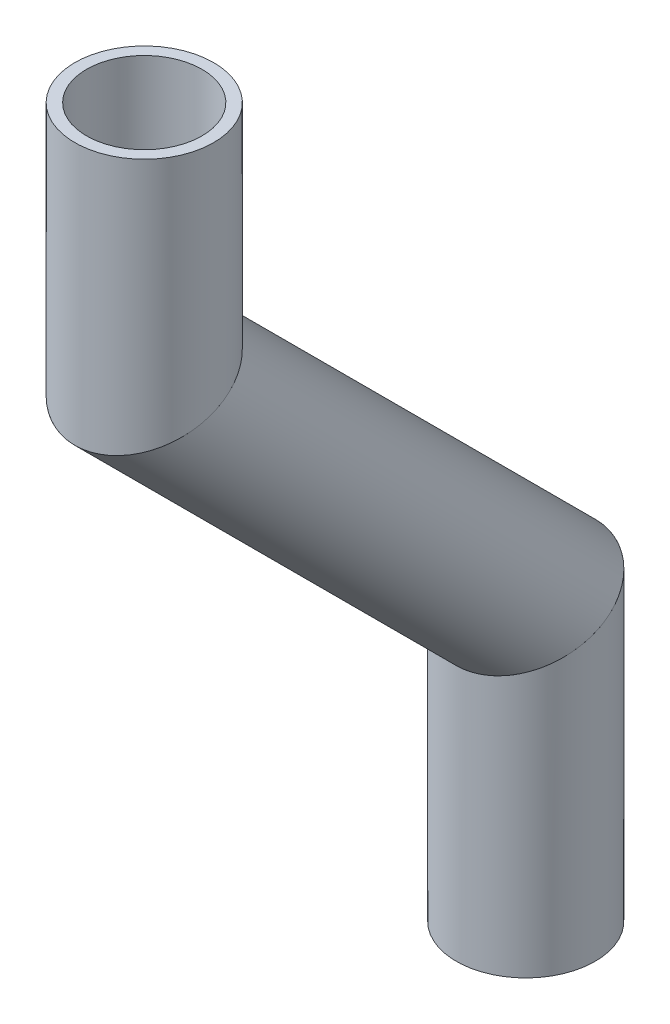
ISO-10303-21;
HEADER;
FILE_DESCRIPTION(('STEP AP214'),'2;1');
FILE_NAME('part.step','',(''),(''),'','','');
FILE_SCHEMA(('AUTOMOTIVE_DESIGN { 1 0 10303 214 1 1 1 1 }'));
ENDSEC;
DATA;
#1=APPLICATION_CONTEXT('core data for automotive mechanical design processes');
#2=APPLICATION_PROTOCOL_DEFINITION('international standard','automotive_design',2000,#1);
#3=PRODUCT_CONTEXT('',#1,'mechanical');
#4=PRODUCT('Part','Part','',(#3));
#5=PRODUCT_RELATED_PRODUCT_CATEGORY('part','',(#4));
#6=PRODUCT_DEFINITION_FORMATION('','',#4);
#7=PRODUCT_DEFINITION_CONTEXT('part definition',#1,'design');
#8=PRODUCT_DEFINITION('design','',#6,#7);
#9=PRODUCT_DEFINITION_SHAPE('','',#8);
#10=(LENGTH_UNIT() NAMED_UNIT(*) SI_UNIT(.MILLI.,.METRE.));
#11=(NAMED_UNIT(*) PLANE_ANGLE_UNIT() SI_UNIT($,.RADIAN.));
#12=(NAMED_UNIT(*) SI_UNIT($,.STERADIAN.) SOLID_ANGLE_UNIT());
#13=UNCERTAINTY_MEASURE_WITH_UNIT(LENGTH_MEASURE(1.E-05),#10,'distance_accuracy_value','');
#14=(GEOMETRIC_REPRESENTATION_CONTEXT(3) GLOBAL_UNCERTAINTY_ASSIGNED_CONTEXT((#13)) GLOBAL_UNIT_ASSIGNED_CONTEXT((#10,
#11,#12)) REPRESENTATION_CONTEXT('',''));
#15=CARTESIAN_POINT('',(0.,0.,0.));
#16=DIRECTION('',(0.,0.,1.));
#17=DIRECTION('',(1.,0.,0.));
#18=AXIS2_PLACEMENT_3D('',#15,#16,#17);
#19=CARTESIAN_POINT('',(0.,-456.70193255657,362.765281468092));
#20=DIRECTION('',(0.,1.,0.));
#21=DIRECTION('',(0.,0.,1.));
#22=AXIS2_PLACEMENT_3D('',#19,#20,#21);
#23=CYLINDRICAL_SURFACE('',#22,5.28319999999999);
#24=CARTESIAN_POINT('',(0.,-435.34106483783,362.765281468092));
#25=DIRECTION('',(0.,-1.,0.));
#26=DIRECTION('',(0.,0.,-1.));
#27=AXIS2_PLACEMENT_3D('',#24,#25,#26);
#28=CIRCLE('',#27,5.28319999999999);
#29=CARTESIAN_POINT('',(0.,-435.34106483783,357.482081468092));
#30=VERTEX_POINT('',#29);
#31=EDGE_CURVE('E55',#30,#30,#28,.T.);
#32=ORIENTED_EDGE('',*,*,#31,.F.);
#33=EDGE_LOOP('',(#32));
#34=FACE_BOUND('',#33,.T.);
#35=CARTESIAN_POINT('',(0.,-456.70193255657,362.765281468092));
#36=DIRECTION('',(0.,-0.923879532511287,-0.38268343236509));
#37=DIRECTION('',(0.,0.38268343236509,-0.923879532511287));
#38=AXIS2_PLACEMENT_3D('',#35,#36,#37);
#39=ELLIPSE('',#38,5.71849447258476,5.28319999999999);
#40=CARTESIAN_POINT('',(0.,-454.51355946384,357.482081468092));
#41=VERTEX_POINT('',#40);
#42=EDGE_CURVE('E51',#41,#41,#39,.T.);
#43=ORIENTED_EDGE('',*,*,#42,.T.);
#44=EDGE_LOOP('',(#43));
#45=FACE_BOUND('',#44,.T.);
#46=ADVANCED_FACE('F47',(#34,#45),#23,.F.);
#47=CARTESIAN_POINT('',(0.,-456.70193255657,362.765281468092));
#48=DIRECTION('',(0.,1.,0.));
#49=DIRECTION('',(0.,0.,1.));
#50=AXIS2_PLACEMENT_3D('',#47,#48,#49);
#51=CYLINDRICAL_SURFACE('',#50,6.35);
#52=CARTESIAN_POINT('',(0.,-435.34106483783,362.765281468092));
#53=DIRECTION('',(0.,-1.,0.));
#54=DIRECTION('',(0.,0.,-1.));
#55=AXIS2_PLACEMENT_3D('',#52,#53,#54);
#56=CIRCLE('',#55,6.35);
#57=CARTESIAN_POINT('',(0.,-435.34106483783,356.415281468092));
#58=VERTEX_POINT('',#57);
#59=EDGE_CURVE('E59',#58,#58,#56,.T.);
#60=ORIENTED_EDGE('',*,*,#59,.T.);
#61=EDGE_LOOP('',(#60));
#62=FACE_BOUND('',#61,.T.);
#63=CARTESIAN_POINT('',(0.,-456.70193255657,362.765281468092));
#64=DIRECTION('',(0.,-0.923879532511287,-0.38268343236509));
#65=DIRECTION('',(0.,0.38268343236509,-0.923879532511287));
#66=AXIS2_PLACEMENT_3D('',#63,#64,#65);
#67=ELLIPSE('',#66,6.8731904718567,6.35);
#68=CARTESIAN_POINT('',(0.,-454.0716764355,356.415281468092));
#69=VERTEX_POINT('',#68);
#70=EDGE_CURVE('E12',#69,#69,#67,.T.);
#71=ORIENTED_EDGE('',*,*,#70,.F.);
#72=EDGE_LOOP('',(#71));
#73=FACE_BOUND('',#72,.T.);
#74=ADVANCED_FACE('F74',(#62,#73),#51,.T.);
#75=CARTESIAN_POINT('',(0.,-435.34106483783,362.765281468092));
#76=DIRECTION('',(0.,-1.,0.));
#77=DIRECTION('',(0.,0.,-1.));
#78=AXIS2_PLACEMENT_3D('',#75,#76,#77);
#79=PLANE('',#78);
#80=ORIENTED_EDGE('',*,*,#31,.T.);
#81=EDGE_LOOP('',(#80));
#82=FACE_BOUND('',#81,.T.);
#83=ORIENTED_EDGE('',*,*,#59,.F.);
#84=EDGE_LOOP('',(#83));
#85=FACE_BOUND('',#84,.T.);
#86=ADVANCED_FACE('F70',(#82,#85),#79,.F.);
#87=CARTESIAN_POINT('',(0.,-456.70193255657,362.765281468092));
#88=DIRECTION('',(0.,-0.923879532511287,-0.38268343236509));
#89=DIRECTION('',(0.,0.38268343236509,-0.923879532511287));
#90=AXIS2_PLACEMENT_3D('',#87,#88,#89);
#91=PLANE('',#90);
#92=ORIENTED_EDGE('',*,*,#42,.F.);
#93=EDGE_LOOP('',(#92));
#94=FACE_BOUND('',#93,.T.);
#95=ORIENTED_EDGE('',*,*,#70,.T.);
#96=EDGE_LOOP('',(#95));
#97=FACE_BOUND('',#96,.T.);
#98=ADVANCED_FACE('F49',(#94,#97),#91,.T.);
#99=CLOSED_SHELL('',(#46,#74,#86,#98));
#100=MANIFOLD_SOLID_BREP('B2',#99);
#101=CARTESIAN_POINT('',(0.,-491.612620795712,327.854593228949));
#102=DIRECTION('',(0.,0.707106781186547,0.707106781186547));
#103=DIRECTION('',(0.,-0.707106781186548,0.707106781186548));
#104=AXIS2_PLACEMENT_3D('',#101,#102,#103);
#105=CYLINDRICAL_SURFACE('',#104,5.28319999999999);
#106=CARTESIAN_POINT('',(0.,-491.612620795712,327.854593228949));
#107=DIRECTION('',(0.,-0.923879532511287,-0.38268343236509));
#108=DIRECTION('',(0.,-0.38268343236509,0.923879532511287));
#109=AXIS2_PLACEMENT_3D('',#106,#107,#108);
#110=ELLIPSE('',#109,5.71849447258476,5.28319999999999);
#111=CARTESIAN_POINT('',(0.,-493.800993888442,333.137793228949));
#112=VERTEX_POINT('',#111);
#113=EDGE_CURVE('E150',#112,#112,#110,.T.);
#114=ORIENTED_EDGE('',*,*,#113,.T.);
#115=EDGE_LOOP('',(#114));
#116=FACE_BOUND('',#115,.T.);
#117=CARTESIAN_POINT('',(0.,-456.70193255657,362.765281468091));
#118=DIRECTION('',(0.,0.923879532511287,0.38268343236509));
#119=DIRECTION('',(0.,-0.38268343236509,0.923879532511287));
#120=AXIS2_PLACEMENT_3D('',#117,#118,#119);
#121=ELLIPSE('',#120,5.71849447258476,5.28319999999999);
#122=CARTESIAN_POINT('',(0.,-458.890305649299,368.048481468091));
#123=VERTEX_POINT('',#122);
#124=EDGE_CURVE('E140',#123,#123,#121,.T.);
#125=ORIENTED_EDGE('',*,*,#124,.T.);
#126=EDGE_LOOP('',(#125));
#127=FACE_BOUND('',#126,.T.);
#128=ADVANCED_FACE('F136',(#116,#127),#105,.F.);
#129=CARTESIAN_POINT('',(0.,-491.612620795712,327.854593228949));
#130=DIRECTION('',(0.,0.707106781186547,0.707106781186547));
#131=DIRECTION('',(0.,-0.707106781186548,0.707106781186548));
#132=AXIS2_PLACEMENT_3D('',#129,#130,#131);
#133=CYLINDRICAL_SURFACE('',#132,6.35);
#134=CARTESIAN_POINT('',(0.,-491.612620795712,327.854593228949));
#135=DIRECTION('',(0.,-0.923879532511287,-0.38268343236509));
#136=DIRECTION('',(0.,-0.38268343236509,0.923879532511287));
#137=AXIS2_PLACEMENT_3D('',#134,#135,#136);
#138=ELLIPSE('',#137,6.8731904718567,6.35);
#139=CARTESIAN_POINT('',(0.,-494.242876916781,334.204593228949));
#140=VERTEX_POINT('',#139);
#141=EDGE_CURVE('E144',#140,#140,#138,.T.);
#142=ORIENTED_EDGE('',*,*,#141,.F.);
#143=EDGE_LOOP('',(#142));
#144=FACE_BOUND('',#143,.T.);
#145=CARTESIAN_POINT('',(0.,-456.70193255657,362.765281468091));
#146=DIRECTION('',(0.,0.923879532511287,0.38268343236509));
#147=DIRECTION('',(0.,-0.38268343236509,0.923879532511287));
#148=AXIS2_PLACEMENT_3D('',#145,#146,#147);
#149=ELLIPSE('',#148,6.8731904718567,6.35);
#150=CARTESIAN_POINT('',(0.,-459.332188677639,369.115281468091));
#151=VERTEX_POINT('',#150);
#152=EDGE_CURVE('E46',#151,#151,#149,.T.);
#153=ORIENTED_EDGE('',*,*,#152,.F.);
#154=EDGE_LOOP('',(#153));
#155=FACE_BOUND('',#154,.T.);
#156=ADVANCED_FACE('F163',(#144,#155),#133,.T.);
#157=CARTESIAN_POINT('',(0.,-491.612620795712,327.854593228949));
#158=DIRECTION('',(0.,-0.923879532511287,-0.38268343236509));
#159=DIRECTION('',(0.,0.38268343236509,-0.923879532511287));
#160=AXIS2_PLACEMENT_3D('',#157,#158,#159);
#161=PLANE('',#160);
#162=ORIENTED_EDGE('',*,*,#113,.F.);
#163=EDGE_LOOP('',(#162));
#164=FACE_BOUND('',#163,.T.);
#165=ORIENTED_EDGE('',*,*,#141,.T.);
#166=EDGE_LOOP('',(#165));
#167=FACE_BOUND('',#166,.T.);
#168=ADVANCED_FACE('F159',(#164,#167),#161,.T.);
#169=CARTESIAN_POINT('',(0.,-456.70193255657,362.765281468092));
#170=DIRECTION('',(0.,0.923879532511287,0.38268343236509));
#171=DIRECTION('',(0.,-0.38268343236509,0.923879532511287));
#172=AXIS2_PLACEMENT_3D('',#169,#170,#171);
#173=PLANE('',#172);
#174=ORIENTED_EDGE('',*,*,#124,.F.);
#175=EDGE_LOOP('',(#174));
#176=FACE_BOUND('',#175,.T.);
#177=ORIENTED_EDGE('',*,*,#152,.T.);
#178=EDGE_LOOP('',(#177));
#179=FACE_BOUND('',#178,.T.);
#180=ADVANCED_FACE('F138',(#176,#179),#173,.T.);
#181=CLOSED_SHELL('',(#128,#156,#168,#180));
#182=MANIFOLD_SOLID_BREP('B7',#181);
#183=CARTESIAN_POINT('',(0.,-517.681706901882,327.854593228949));
#184=DIRECTION('',(0.,1.,0.));
#185=DIRECTION('',(0.,0.,1.));
#186=AXIS2_PLACEMENT_3D('',#183,#184,#185);
#187=CYLINDRICAL_SURFACE('',#186,5.28319999999999);
#188=CARTESIAN_POINT('',(0.,-517.681706901882,327.854593228949));
#189=DIRECTION('',(0.,-1.,0.));
#190=DIRECTION('',(0.,0.,-1.));
#191=AXIS2_PLACEMENT_3D('',#188,#189,#190);
#192=CIRCLE('',#191,5.28319999999999);
#193=CARTESIAN_POINT('',(0.,-517.681706901882,322.571393228949));
#194=VERTEX_POINT('',#193);
#195=EDGE_CURVE('E234',#194,#194,#192,.T.);
#196=ORIENTED_EDGE('',*,*,#195,.T.);
#197=EDGE_LOOP('',(#196));
#198=FACE_BOUND('',#197,.T.);
#199=CARTESIAN_POINT('',(0.,-491.612620795712,327.854593228949));
#200=DIRECTION('',(0.,0.923879532511287,0.38268343236509));
#201=DIRECTION('',(0.,0.38268343236509,-0.923879532511287));
#202=AXIS2_PLACEMENT_3D('',#199,#200,#201);
#203=ELLIPSE('',#202,5.71849447258476,5.28319999999999);
#204=CARTESIAN_POINT('',(0.,-489.424247702983,322.571393228949));
#205=VERTEX_POINT('',#204);
#206=EDGE_CURVE('E224',#205,#205,#203,.T.);
#207=ORIENTED_EDGE('',*,*,#206,.T.);
#208=EDGE_LOOP('',(#207));
#209=FACE_BOUND('',#208,.T.);
#210=ADVANCED_FACE('F220',(#198,#209),#187,.F.);
#211=CARTESIAN_POINT('',(0.,-517.681706901882,327.854593228949));
#212=DIRECTION('',(0.,1.,0.));
#213=DIRECTION('',(0.,0.,1.));
#214=AXIS2_PLACEMENT_3D('',#211,#212,#213);
#215=CYLINDRICAL_SURFACE('',#214,6.35);
#216=CARTESIAN_POINT('',(0.,-517.681706901882,327.854593228949));
#217=DIRECTION('',(0.,-1.,0.));
#218=DIRECTION('',(0.,0.,-1.));
#219=AXIS2_PLACEMENT_3D('',#216,#217,#218);
#220=CIRCLE('',#219,6.35);
#221=CARTESIAN_POINT('',(0.,-517.681706901882,321.504593228949));
#222=VERTEX_POINT('',#221);
#223=EDGE_CURVE('E228',#222,#222,#220,.T.);
#224=ORIENTED_EDGE('',*,*,#223,.F.);
#225=EDGE_LOOP('',(#224));
#226=FACE_BOUND('',#225,.T.);
#227=CARTESIAN_POINT('',(0.,-491.612620795712,327.854593228949));
#228=DIRECTION('',(0.,0.923879532511287,0.38268343236509));
#229=DIRECTION('',(0.,0.38268343236509,-0.923879532511287));
#230=AXIS2_PLACEMENT_3D('',#227,#228,#229);
#231=ELLIPSE('',#230,6.8731904718567,6.35);
#232=CARTESIAN_POINT('',(0.,-488.982364674643,321.504593228949));
#233=VERTEX_POINT('',#232);
#234=EDGE_CURVE('E135',#233,#233,#231,.T.);
#235=ORIENTED_EDGE('',*,*,#234,.F.);
#236=EDGE_LOOP('',(#235));
#237=FACE_BOUND('',#236,.T.);
#238=ADVANCED_FACE('F247',(#226,#237),#215,.T.);
#239=CARTESIAN_POINT('',(0.,-517.681706901882,327.854593228949));
#240=DIRECTION('',(0.,-1.,0.));
#241=DIRECTION('',(0.,0.,-1.));
#242=AXIS2_PLACEMENT_3D('',#239,#240,#241);
#243=PLANE('',#242);
#244=ORIENTED_EDGE('',*,*,#195,.F.);
#245=EDGE_LOOP('',(#244));
#246=FACE_BOUND('',#245,.T.);
#247=ORIENTED_EDGE('',*,*,#223,.T.);
#248=EDGE_LOOP('',(#247));
#249=FACE_BOUND('',#248,.T.);
#250=ADVANCED_FACE('F243',(#246,#249),#243,.T.);
#251=CARTESIAN_POINT('',(0.,-491.612620795712,327.854593228949));
#252=DIRECTION('',(0.,0.923879532511287,0.38268343236509));
#253=DIRECTION('',(0.,-0.38268343236509,0.923879532511287));
#254=AXIS2_PLACEMENT_3D('',#251,#252,#253);
#255=PLANE('',#254);
#256=ORIENTED_EDGE('',*,*,#206,.F.);
#257=EDGE_LOOP('',(#256));
#258=FACE_BOUND('',#257,.T.);
#259=ORIENTED_EDGE('',*,*,#234,.T.);
#260=EDGE_LOOP('',(#259));
#261=FACE_BOUND('',#260,.T.);
#262=ADVANCED_FACE('F222',(#258,#261),#255,.T.);
#263=CLOSED_SHELL('',(#210,#238,#250,#262));
#264=MANIFOLD_SOLID_BREP('B41',#263);
#265=ADVANCED_BREP_SHAPE_REPRESENTATION('',(#18,#100,#182,#264),#14);
#266=SHAPE_DEFINITION_REPRESENTATION(#9,#265);
ENDSEC;
END-ISO-10303-21;
